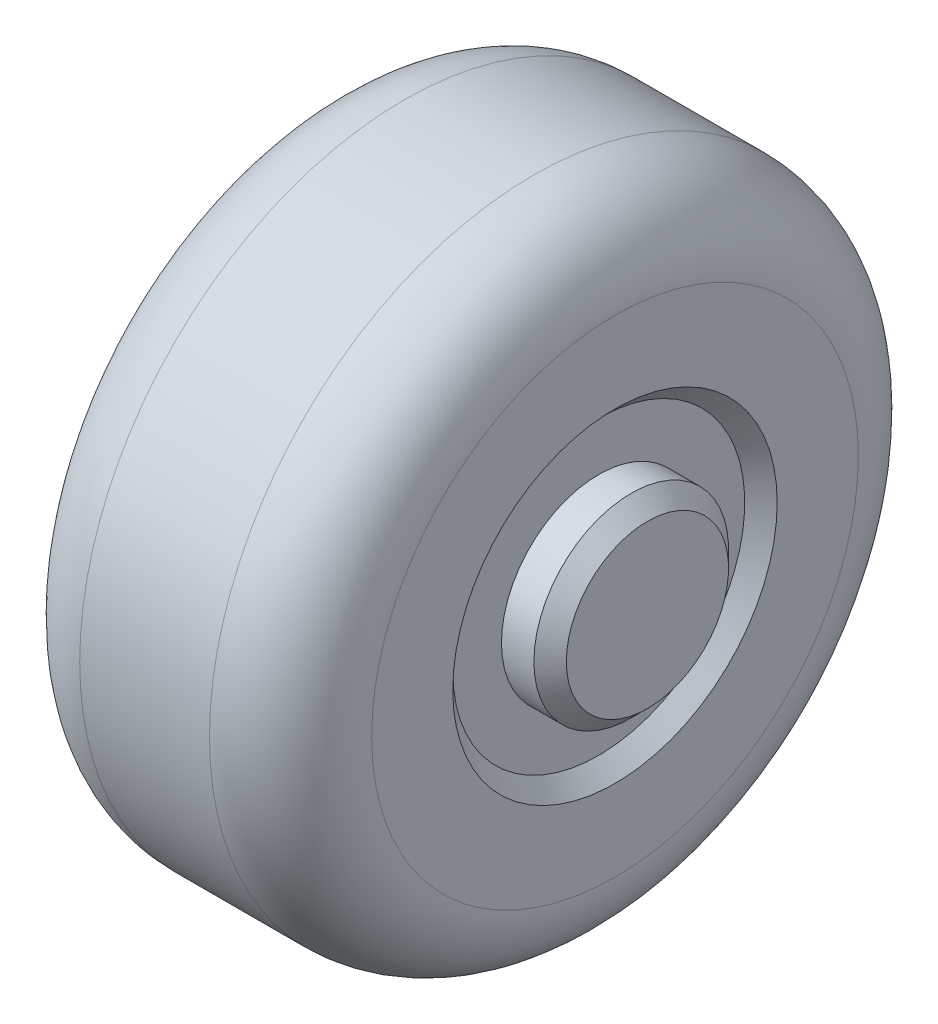
ISO-10303-21;
HEADER;
FILE_DESCRIPTION(('STEP AP214'),'2;1');
FILE_NAME('part.step','',(''),(''),'','','');
FILE_SCHEMA(('AUTOMOTIVE_DESIGN { 1 0 10303 214 1 1 1 1 }'));
ENDSEC;
DATA;
#1=APPLICATION_CONTEXT('core data for automotive mechanical design processes');
#2=APPLICATION_PROTOCOL_DEFINITION('international standard','automotive_design',2000,#1);
#3=PRODUCT_CONTEXT('',#1,'mechanical');
#4=PRODUCT('Part','Part','',(#3));
#5=PRODUCT_RELATED_PRODUCT_CATEGORY('part','',(#4));
#6=PRODUCT_DEFINITION_FORMATION('','',#4);
#7=PRODUCT_DEFINITION_CONTEXT('part definition',#1,'design');
#8=PRODUCT_DEFINITION('design','',#6,#7);
#9=PRODUCT_DEFINITION_SHAPE('','',#8);
#10=(LENGTH_UNIT() NAMED_UNIT(*) SI_UNIT(.MILLI.,.METRE.));
#11=(NAMED_UNIT(*) PLANE_ANGLE_UNIT() SI_UNIT($,.RADIAN.));
#12=(NAMED_UNIT(*) SI_UNIT($,.STERADIAN.) SOLID_ANGLE_UNIT());
#13=UNCERTAINTY_MEASURE_WITH_UNIT(LENGTH_MEASURE(1.E-05),#10,'distance_accuracy_value','');
#14=(GEOMETRIC_REPRESENTATION_CONTEXT(3) GLOBAL_UNCERTAINTY_ASSIGNED_CONTEXT((#13)) GLOBAL_UNIT_ASSIGNED_CONTEXT((#10,
#11,#12)) REPRESENTATION_CONTEXT('',''));
#15=CARTESIAN_POINT('',(0.,0.,0.));
#16=DIRECTION('',(0.,0.,1.));
#17=DIRECTION('',(1.,0.,0.));
#18=AXIS2_PLACEMENT_3D('',#15,#16,#17);
#19=CARTESIAN_POINT('',(-11.,0.,0.));
#20=DIRECTION('',(1.,0.,0.));
#21=DIRECTION('',(0.,0.,-1.));
#22=AXIS2_PLACEMENT_3D('',#19,#20,#21);
#23=PLANE('',#22);
#24=CARTESIAN_POINT('',(-11.,0.,0.));
#25=DIRECTION('',(-1.,0.,0.));
#26=DIRECTION('',(0.,0.,1.));
#27=AXIS2_PLACEMENT_3D('',#24,#25,#26);
#28=CIRCLE('',#27,5.);
#29=CARTESIAN_POINT('',(-11.,0.,5.));
#30=VERTEX_POINT('',#29);
#31=EDGE_CURVE('E10',#30,#30,#28,.T.);
#32=ORIENTED_EDGE('',*,*,#31,.T.);
#33=EDGE_LOOP('',(#32));
#34=FACE_BOUND('',#33,.T.);
#35=ADVANCED_FACE('F33',(#34),#23,.F.);
#36=CARTESIAN_POINT('',(-10.,0.,0.));
#37=DIRECTION('',(1.,0.,0.));
#38=DIRECTION('',(0.,0.,-1.));
#39=AXIS2_PLACEMENT_3D('',#36,#37,#38);
#40=CONICAL_SURFACE('',#39,6.,0.785398163397448);
#41=ORIENTED_EDGE('',*,*,#31,.F.);
#42=EDGE_LOOP('',(#41));
#43=FACE_BOUND('',#42,.T.);
#44=CARTESIAN_POINT('',(-10.,0.,0.));
#45=DIRECTION('',(-1.,0.,0.));
#46=DIRECTION('',(0.,0.,1.));
#47=AXIS2_PLACEMENT_3D('',#44,#45,#46);
#48=CIRCLE('',#47,6.);
#49=CARTESIAN_POINT('',(-10.,0.,6.));
#50=VERTEX_POINT('',#49);
#51=EDGE_CURVE('E39',#50,#50,#48,.T.);
#52=ORIENTED_EDGE('',*,*,#51,.T.);
#53=EDGE_LOOP('',(#52));
#54=FACE_BOUND('',#53,.T.);
#55=ADVANCED_FACE('F95',(#43,#54),#40,.T.);
#56=CARTESIAN_POINT('',(11.,0.,0.));
#57=DIRECTION('',(-1.,0.,0.));
#58=DIRECTION('',(0.,0.,1.));
#59=AXIS2_PLACEMENT_3D('',#56,#57,#58);
#60=CYLINDRICAL_SURFACE('',#59,6.);
#61=ORIENTED_EDGE('',*,*,#51,.F.);
#62=EDGE_LOOP('',(#61));
#63=FACE_BOUND('',#62,.T.);
#64=CARTESIAN_POINT('',(-8.,0.,0.));
#65=DIRECTION('',(-1.,0.,0.));
#66=DIRECTION('',(0.,0.,1.));
#67=AXIS2_PLACEMENT_3D('',#64,#65,#66);
#68=CIRCLE('',#67,6.);
#69=CARTESIAN_POINT('',(-8.,0.,6.));
#70=VERTEX_POINT('',#69);
#71=EDGE_CURVE('E43',#70,#70,#68,.T.);
#72=ORIENTED_EDGE('',*,*,#71,.T.);
#73=EDGE_LOOP('',(#72));
#74=FACE_BOUND('',#73,.T.);
#75=ADVANCED_FACE('F99',(#63,#74),#60,.T.);
#76=CARTESIAN_POINT('',(-8.,6.,0.));
#77=DIRECTION('',(1.,0.,0.));
#78=DIRECTION('',(0.,0.,-1.));
#79=AXIS2_PLACEMENT_3D('',#76,#77,#78);
#80=PLANE('',#79);
#81=ORIENTED_EDGE('',*,*,#71,.F.);
#82=EDGE_LOOP('',(#81));
#83=FACE_BOUND('',#82,.T.);
#84=CARTESIAN_POINT('',(-8.,0.,0.));
#85=DIRECTION('',(-1.,0.,0.));
#86=DIRECTION('',(0.,0.,1.));
#87=AXIS2_PLACEMENT_3D('',#84,#85,#86);
#88=CIRCLE('',#87,9.);
#89=CARTESIAN_POINT('',(-8.,0.,9.));
#90=VERTEX_POINT('',#89);
#91=EDGE_CURVE('E47',#90,#90,#88,.T.);
#92=ORIENTED_EDGE('',*,*,#91,.T.);
#93=EDGE_LOOP('',(#92));
#94=FACE_BOUND('',#93,.T.);
#95=ADVANCED_FACE('F104',(#83,#94),#80,.F.);
#96=CARTESIAN_POINT('',(-9.,0.,0.));
#97=DIRECTION('',(-1.,0.,0.));
#98=DIRECTION('',(0.,0.,1.));
#99=AXIS2_PLACEMENT_3D('',#96,#97,#98);
#100=CONICAL_SURFACE('',#99,10.,0.78539816339745);
#101=ORIENTED_EDGE('',*,*,#91,.F.);
#102=EDGE_LOOP('',(#101));
#103=FACE_BOUND('',#102,.T.);
#104=CARTESIAN_POINT('',(-9.,0.,0.));
#105=DIRECTION('',(-1.,0.,0.));
#106=DIRECTION('',(0.,0.,1.));
#107=AXIS2_PLACEMENT_3D('',#104,#105,#106);
#108=CIRCLE('',#107,10.);
#109=CARTESIAN_POINT('',(-9.,0.,10.));
#110=VERTEX_POINT('',#109);
#111=EDGE_CURVE('E52',#110,#110,#108,.T.);
#112=ORIENTED_EDGE('',*,*,#111,.T.);
#113=EDGE_LOOP('',(#112));
#114=FACE_BOUND('',#113,.T.);
#115=ADVANCED_FACE('F110',(#103,#114),#100,.F.);
#116=CARTESIAN_POINT('',(-9.,10.,0.));
#117=DIRECTION('',(1.,0.,0.));
#118=DIRECTION('',(0.,0.,-1.));
#119=AXIS2_PLACEMENT_3D('',#116,#117,#118);
#120=PLANE('',#119);
#121=ORIENTED_EDGE('',*,*,#111,.F.);
#122=EDGE_LOOP('',(#121));
#123=FACE_BOUND('',#122,.T.);
#124=CARTESIAN_POINT('',(-9.,0.,0.));
#125=DIRECTION('',(-1.,0.,0.));
#126=DIRECTION('',(0.,0.,1.));
#127=AXIS2_PLACEMENT_3D('',#124,#125,#126);
#128=CIRCLE('',#127,15.);
#129=CARTESIAN_POINT('',(-9.,0.,15.));
#130=VERTEX_POINT('',#129);
#131=EDGE_CURVE('E55',#130,#130,#128,.T.);
#132=ORIENTED_EDGE('',*,*,#131,.T.);
#133=EDGE_LOOP('',(#132));
#134=FACE_BOUND('',#133,.T.);
#135=ADVANCED_FACE('F114',(#123,#134),#120,.F.);
#136=CARTESIAN_POINT('',(-4.00000000000037,0.,0.));
#137=DIRECTION('',(-1.,0.,0.));
#138=DIRECTION('',(0.,0.,1.));
#139=AXIS2_PLACEMENT_3D('',#136,#137,#138);
#140=TOROIDAL_SURFACE('',#139,15.0000000000004,4.99999999999963);
#141=ORIENTED_EDGE('',*,*,#131,.F.);
#142=EDGE_LOOP('',(#141));
#143=FACE_BOUND('',#142,.T.);
#144=CARTESIAN_POINT('',(-4.,0.,0.));
#145=DIRECTION('',(-1.,0.,0.));
#146=DIRECTION('',(0.,0.,1.));
#147=AXIS2_PLACEMENT_3D('',#144,#145,#146);
#148=CIRCLE('',#147,20.);
#149=CARTESIAN_POINT('',(-4.,0.,20.));
#150=VERTEX_POINT('',#149);
#151=EDGE_CURVE('E58',#150,#150,#148,.T.);
#152=ORIENTED_EDGE('',*,*,#151,.T.);
#153=EDGE_LOOP('',(#152));
#154=FACE_BOUND('',#153,.T.);
#155=ADVANCED_FACE('F118',(#143,#154),#140,.T.);
#156=CARTESIAN_POINT('',(11.,0.,0.));
#157=DIRECTION('',(-1.,0.,0.));
#158=DIRECTION('',(0.,0.,1.));
#159=AXIS2_PLACEMENT_3D('',#156,#157,#158);
#160=CYLINDRICAL_SURFACE('',#159,20.);
#161=ORIENTED_EDGE('',*,*,#151,.F.);
#162=EDGE_LOOP('',(#161));
#163=FACE_BOUND('',#162,.T.);
#164=CARTESIAN_POINT('',(4.,0.,0.));
#165=DIRECTION('',(-1.,0.,0.));
#166=DIRECTION('',(0.,0.,1.));
#167=AXIS2_PLACEMENT_3D('',#164,#165,#166);
#168=CIRCLE('',#167,20.);
#169=CARTESIAN_POINT('',(4.,0.,20.));
#170=VERTEX_POINT('',#169);
#171=EDGE_CURVE('E61',#170,#170,#168,.T.);
#172=ORIENTED_EDGE('',*,*,#171,.T.);
#173=EDGE_LOOP('',(#172));
#174=FACE_BOUND('',#173,.T.);
#175=ADVANCED_FACE('F122',(#163,#174),#160,.T.);
#176=CARTESIAN_POINT('',(4.00000000000038,0.,0.));
#177=DIRECTION('',(-1.,0.,0.));
#178=DIRECTION('',(0.,0.,1.));
#179=AXIS2_PLACEMENT_3D('',#176,#177,#178);
#180=TOROIDAL_SURFACE('',#179,15.0000000000004,4.99999999999962);
#181=ORIENTED_EDGE('',*,*,#171,.F.);
#182=EDGE_LOOP('',(#181));
#183=FACE_BOUND('',#182,.T.);
#184=CARTESIAN_POINT('',(9.,0.,0.));
#185=DIRECTION('',(-1.,0.,0.));
#186=DIRECTION('',(0.,0.,1.));
#187=AXIS2_PLACEMENT_3D('',#184,#185,#186);
#188=CIRCLE('',#187,15.);
#189=CARTESIAN_POINT('',(9.,0.,15.));
#190=VERTEX_POINT('',#189);
#191=EDGE_CURVE('E64',#190,#190,#188,.T.);
#192=ORIENTED_EDGE('',*,*,#191,.T.);
#193=EDGE_LOOP('',(#192));
#194=FACE_BOUND('',#193,.T.);
#195=ADVANCED_FACE('F126',(#183,#194),#180,.T.);
#196=CARTESIAN_POINT('',(9.,15.,0.));
#197=DIRECTION('',(-1.,0.,0.));
#198=DIRECTION('',(0.,0.,1.));
#199=AXIS2_PLACEMENT_3D('',#196,#197,#198);
#200=PLANE('',#199);
#201=ORIENTED_EDGE('',*,*,#191,.F.);
#202=EDGE_LOOP('',(#201));
#203=FACE_BOUND('',#202,.T.);
#204=CARTESIAN_POINT('',(9.,0.,0.));
#205=DIRECTION('',(-1.,0.,0.));
#206=DIRECTION('',(0.,0.,1.));
#207=AXIS2_PLACEMENT_3D('',#204,#205,#206);
#208=CIRCLE('',#207,10.);
#209=CARTESIAN_POINT('',(9.,0.,10.));
#210=VERTEX_POINT('',#209);
#211=EDGE_CURVE('E67',#210,#210,#208,.T.);
#212=ORIENTED_EDGE('',*,*,#211,.T.);
#213=EDGE_LOOP('',(#212));
#214=FACE_BOUND('',#213,.T.);
#215=ADVANCED_FACE('F130',(#203,#214),#200,.F.);
#216=CARTESIAN_POINT('',(8.,0.,0.));
#217=DIRECTION('',(1.,0.,0.));
#218=DIRECTION('',(0.,0.,-1.));
#219=AXIS2_PLACEMENT_3D('',#216,#217,#218);
#220=CONICAL_SURFACE('',#219,9.,0.785398163397449);
#221=ORIENTED_EDGE('',*,*,#211,.F.);
#222=EDGE_LOOP('',(#221));
#223=FACE_BOUND('',#222,.T.);
#224=CARTESIAN_POINT('',(8.,0.,0.));
#225=DIRECTION('',(-1.,0.,0.));
#226=DIRECTION('',(0.,0.,1.));
#227=AXIS2_PLACEMENT_3D('',#224,#225,#226);
#228=CIRCLE('',#227,9.);
#229=CARTESIAN_POINT('',(8.,0.,9.));
#230=VERTEX_POINT('',#229);
#231=EDGE_CURVE('E70',#230,#230,#228,.T.);
#232=ORIENTED_EDGE('',*,*,#231,.T.);
#233=EDGE_LOOP('',(#232));
#234=FACE_BOUND('',#233,.T.);
#235=ADVANCED_FACE('F134',(#223,#234),#220,.F.);
#236=CARTESIAN_POINT('',(8.,9.,0.));
#237=DIRECTION('',(-1.,0.,0.));
#238=DIRECTION('',(0.,0.,1.));
#239=AXIS2_PLACEMENT_3D('',#236,#237,#238);
#240=PLANE('',#239);
#241=ORIENTED_EDGE('',*,*,#231,.F.);
#242=EDGE_LOOP('',(#241));
#243=FACE_BOUND('',#242,.T.);
#244=CARTESIAN_POINT('',(8.,0.,0.));
#245=DIRECTION('',(-1.,0.,0.));
#246=DIRECTION('',(0.,0.,1.));
#247=AXIS2_PLACEMENT_3D('',#244,#245,#246);
#248=CIRCLE('',#247,6.);
#249=CARTESIAN_POINT('',(8.,0.,6.));
#250=VERTEX_POINT('',#249);
#251=EDGE_CURVE('E73',#250,#250,#248,.T.);
#252=ORIENTED_EDGE('',*,*,#251,.T.);
#253=EDGE_LOOP('',(#252));
#254=FACE_BOUND('',#253,.T.);
#255=ADVANCED_FACE('F138',(#243,#254),#240,.F.);
#256=CARTESIAN_POINT('',(11.,0.,0.));
#257=DIRECTION('',(-1.,0.,0.));
#258=DIRECTION('',(0.,0.,1.));
#259=AXIS2_PLACEMENT_3D('',#256,#257,#258);
#260=CYLINDRICAL_SURFACE('',#259,6.);
#261=ORIENTED_EDGE('',*,*,#251,.F.);
#262=EDGE_LOOP('',(#261));
#263=FACE_BOUND('',#262,.T.);
#264=CARTESIAN_POINT('',(10.,0.,0.));
#265=DIRECTION('',(-1.,0.,0.));
#266=DIRECTION('',(0.,0.,1.));
#267=AXIS2_PLACEMENT_3D('',#264,#265,#266);
#268=CIRCLE('',#267,6.);
#269=CARTESIAN_POINT('',(10.,0.,6.));
#270=VERTEX_POINT('',#269);
#271=EDGE_CURVE('E76',#270,#270,#268,.T.);
#272=ORIENTED_EDGE('',*,*,#271,.T.);
#273=EDGE_LOOP('',(#272));
#274=FACE_BOUND('',#273,.T.);
#275=ADVANCED_FACE('F91',(#263,#274),#260,.T.);
#276=CARTESIAN_POINT('',(11.,0.,0.));
#277=DIRECTION('',(-1.,0.,0.));
#278=DIRECTION('',(0.,0.,1.));
#279=AXIS2_PLACEMENT_3D('',#276,#277,#278);
#280=CONICAL_SURFACE('',#279,5.,0.785398163397449);
#281=ORIENTED_EDGE('',*,*,#271,.F.);
#282=EDGE_LOOP('',(#281));
#283=FACE_BOUND('',#282,.T.);
#284=CARTESIAN_POINT('',(11.,0.,0.));
#285=DIRECTION('',(-1.,0.,0.));
#286=DIRECTION('',(0.,0.,1.));
#287=AXIS2_PLACEMENT_3D('',#284,#285,#286);
#288=CIRCLE('',#287,5.);
#289=CARTESIAN_POINT('',(11.,0.,5.));
#290=VERTEX_POINT('',#289);
#291=EDGE_CURVE('E79',#290,#290,#288,.T.);
#292=ORIENTED_EDGE('',*,*,#291,.T.);
#293=EDGE_LOOP('',(#292));
#294=FACE_BOUND('',#293,.T.);
#295=ADVANCED_FACE('F83',(#283,#294),#280,.T.);
#296=CARTESIAN_POINT('',(11.,5.,0.));
#297=DIRECTION('',(-1.,0.,0.));
#298=DIRECTION('',(0.,0.,1.));
#299=AXIS2_PLACEMENT_3D('',#296,#297,#298);
#300=PLANE('',#299);
#301=ORIENTED_EDGE('',*,*,#291,.F.);
#302=EDGE_LOOP('',(#301));
#303=FACE_BOUND('',#302,.T.);
#304=ADVANCED_FACE('F85',(#303),#300,.F.);
#305=CLOSED_SHELL('',(#35,#55,#75,#95,#115,#135,#155,#175,#195,#215,#235,#255,#275,#295,#304));
#306=MANIFOLD_SOLID_BREP('B2',#305);
#307=ADVANCED_BREP_SHAPE_REPRESENTATION('',(#18,#306),#14);
#308=SHAPE_DEFINITION_REPRESENTATION(#9,#307);
ENDSEC;
END-ISO-10303-21;
